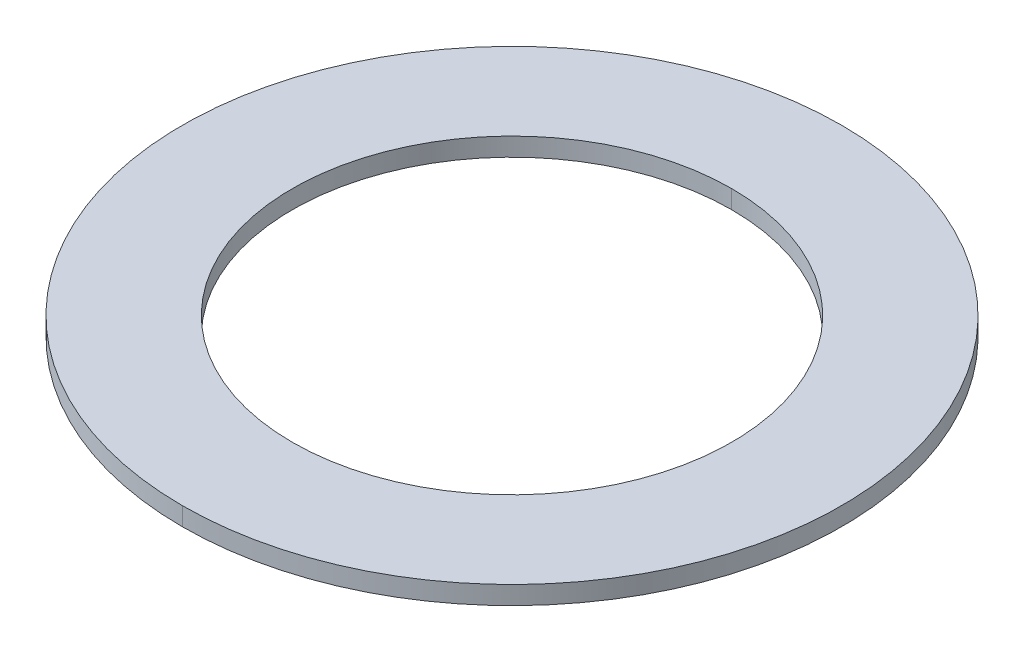
ISO-10303-21;
HEADER;
FILE_DESCRIPTION(('STEP AP214'),'2;1');
FILE_NAME('part.step','',(''),(''),'','','');
FILE_SCHEMA(('AUTOMOTIVE_DESIGN { 1 0 10303 214 1 1 1 1 }'));
ENDSEC;
DATA;
#1=APPLICATION_CONTEXT('core data for automotive mechanical design processes');
#2=APPLICATION_PROTOCOL_DEFINITION('international standard','automotive_design',2000,#1);
#3=PRODUCT_CONTEXT('',#1,'mechanical');
#4=PRODUCT('Part','Part','',(#3));
#5=PRODUCT_RELATED_PRODUCT_CATEGORY('part','',(#4));
#6=PRODUCT_DEFINITION_FORMATION('','',#4);
#7=PRODUCT_DEFINITION_CONTEXT('part definition',#1,'design');
#8=PRODUCT_DEFINITION('design','',#6,#7);
#9=PRODUCT_DEFINITION_SHAPE('','',#8);
#10=(LENGTH_UNIT() NAMED_UNIT(*) SI_UNIT(.MILLI.,.METRE.));
#11=(NAMED_UNIT(*) PLANE_ANGLE_UNIT() SI_UNIT($,.RADIAN.));
#12=(NAMED_UNIT(*) SI_UNIT($,.STERADIAN.) SOLID_ANGLE_UNIT());
#13=UNCERTAINTY_MEASURE_WITH_UNIT(LENGTH_MEASURE(1.E-05),#10,'distance_accuracy_value','');
#14=(GEOMETRIC_REPRESENTATION_CONTEXT(3) GLOBAL_UNCERTAINTY_ASSIGNED_CONTEXT((#13)) GLOBAL_UNIT_ASSIGNED_CONTEXT((#10,
#11,#12)) REPRESENTATION_CONTEXT('',''));
#15=CARTESIAN_POINT('',(0.,0.,0.));
#16=DIRECTION('',(0.,0.,1.));
#17=DIRECTION('',(1.,0.,0.));
#18=AXIS2_PLACEMENT_3D('',#15,#16,#17);
#19=CARTESIAN_POINT('',(0.,0.25,0.));
#20=DIRECTION('',(0.,-1.,0.));
#21=DIRECTION('',(0.,0.,-1.));
#22=AXIS2_PLACEMENT_3D('',#19,#20,#21);
#23=CYLINDRICAL_SURFACE('',#22,3.);
#24=CARTESIAN_POINT('',(0.,0.25,0.));
#25=DIRECTION('',(0.,1.,0.));
#26=DIRECTION('',(0.,0.,1.));
#27=AXIS2_PLACEMENT_3D('',#24,#25,#26);
#28=CIRCLE('',#27,3.);
#29=CARTESIAN_POINT('',(0.,0.25,-3.));
#30=VERTEX_POINT('',#29);
#31=CARTESIAN_POINT('',(0.,0.25,3.));
#32=VERTEX_POINT('',#31);
#33=EDGE_CURVE('E11',#30,#32,#28,.T.);
#34=ORIENTED_EDGE('',*,*,#33,.T.);
#35=DIRECTION('',(0.,-1.,0.));
#36=VECTOR('',#35,1.);
#37=CARTESIAN_POINT('',(0.,0.25,3.));
#38=LINE('',#37,#36);
#39=CARTESIAN_POINT('',(0.,0.,3.));
#40=VERTEX_POINT('',#39);
#41=EDGE_CURVE('E27',#32,#40,#38,.T.);
#42=ORIENTED_EDGE('',*,*,#41,.T.);
#43=CARTESIAN_POINT('',(0.,0.,0.));
#44=DIRECTION('',(0.,1.,0.));
#45=DIRECTION('',(0.,0.,1.));
#46=AXIS2_PLACEMENT_3D('',#43,#44,#45);
#47=CIRCLE('',#46,3.);
#48=CARTESIAN_POINT('',(0.,0.,-3.));
#49=VERTEX_POINT('',#48);
#50=EDGE_CURVE('E85',#49,#40,#47,.T.);
#51=ORIENTED_EDGE('',*,*,#50,.F.);
#52=DIRECTION('',(0.,-1.,0.));
#53=VECTOR('',#52,1.);
#54=CARTESIAN_POINT('',(0.,0.25,-3.));
#55=LINE('',#54,#53);
#56=EDGE_CURVE('E105',#30,#49,#55,.T.);
#57=ORIENTED_EDGE('',*,*,#56,.F.);
#58=EDGE_LOOP('',(#34,#42,#51,#57));
#59=FACE_BOUND('',#58,.T.);
#60=ADVANCED_FACE('F16',(#59),#23,.F.);
#61=CARTESIAN_POINT('',(0.,0.25,0.));
#62=DIRECTION('',(0.,-1.,0.));
#63=DIRECTION('',(0.,0.,-1.));
#64=AXIS2_PLACEMENT_3D('',#61,#62,#63);
#65=CYLINDRICAL_SURFACE('',#64,4.5);
#66=CARTESIAN_POINT('',(0.,0.25,0.));
#67=DIRECTION('',(0.,1.,0.));
#68=DIRECTION('',(0.,0.,1.));
#69=AXIS2_PLACEMENT_3D('',#66,#67,#68);
#70=CIRCLE('',#69,4.5);
#71=CARTESIAN_POINT('',(0.,0.25,4.5));
#72=VERTEX_POINT('',#71);
#73=CARTESIAN_POINT('',(0.,0.25,-4.5));
#74=VERTEX_POINT('',#73);
#75=EDGE_CURVE('E78',#72,#74,#70,.T.);
#76=ORIENTED_EDGE('',*,*,#75,.F.);
#77=DIRECTION('',(0.,-1.,0.));
#78=VECTOR('',#77,1.);
#79=CARTESIAN_POINT('',(0.,0.25,4.5));
#80=LINE('',#79,#78);
#81=CARTESIAN_POINT('',(0.,0.,4.5));
#82=VERTEX_POINT('',#81);
#83=EDGE_CURVE('E80',#72,#82,#80,.T.);
#84=ORIENTED_EDGE('',*,*,#83,.T.);
#85=CARTESIAN_POINT('',(0.,0.,0.));
#86=DIRECTION('',(0.,1.,0.));
#87=DIRECTION('',(0.,0.,1.));
#88=AXIS2_PLACEMENT_3D('',#85,#86,#87);
#89=CIRCLE('',#88,4.5);
#90=CARTESIAN_POINT('',(0.,0.,-4.5));
#91=VERTEX_POINT('',#90);
#92=EDGE_CURVE('E91',#82,#91,#89,.T.);
#93=ORIENTED_EDGE('',*,*,#92,.T.);
#94=DIRECTION('',(0.,-1.,0.));
#95=VECTOR('',#94,1.);
#96=CARTESIAN_POINT('',(0.,0.25,-4.5));
#97=LINE('',#96,#95);
#98=EDGE_CURVE('E60',#74,#91,#97,.T.);
#99=ORIENTED_EDGE('',*,*,#98,.F.);
#100=EDGE_LOOP('',(#76,#84,#93,#99));
#101=FACE_BOUND('',#100,.T.);
#102=ADVANCED_FACE('F18',(#101),#65,.T.);
#103=CARTESIAN_POINT('',(0.,0.25,0.));
#104=DIRECTION('',(0.,1.,0.));
#105=DIRECTION('',(1.,0.,0.));
#106=AXIS2_PLACEMENT_3D('',#103,#104,#105);
#107=PLANE('',#106);
#108=CARTESIAN_POINT('',(0.,0.25,0.));
#109=DIRECTION('',(0.,1.,0.));
#110=DIRECTION('',(0.,0.,1.));
#111=AXIS2_PLACEMENT_3D('',#108,#109,#110);
#112=CIRCLE('',#111,4.5);
#113=EDGE_CURVE('E84',#74,#72,#112,.T.);
#114=ORIENTED_EDGE('',*,*,#113,.T.);
#115=ORIENTED_EDGE('',*,*,#75,.T.);
#116=EDGE_LOOP('',(#114,#115));
#117=FACE_BOUND('',#116,.T.);
#118=ORIENTED_EDGE('',*,*,#33,.F.);
#119=CARTESIAN_POINT('',(0.,0.25,0.));
#120=DIRECTION('',(0.,1.,0.));
#121=DIRECTION('',(0.,0.,1.));
#122=AXIS2_PLACEMENT_3D('',#119,#120,#121);
#123=CIRCLE('',#122,3.);
#124=EDGE_CURVE('E111',#32,#30,#123,.T.);
#125=ORIENTED_EDGE('',*,*,#124,.F.);
#126=EDGE_LOOP('',(#118,#125));
#127=FACE_BOUND('',#126,.T.);
#128=ADVANCED_FACE('F93',(#117,#127),#107,.T.);
#129=CARTESIAN_POINT('',(0.,0.,0.));
#130=DIRECTION('',(0.,1.,0.));
#131=DIRECTION('',(1.,0.,0.));
#132=AXIS2_PLACEMENT_3D('',#129,#130,#131);
#133=PLANE('',#132);
#134=CARTESIAN_POINT('',(0.,0.,0.));
#135=DIRECTION('',(0.,1.,0.));
#136=DIRECTION('',(0.,0.,1.));
#137=AXIS2_PLACEMENT_3D('',#134,#135,#136);
#138=CIRCLE('',#137,4.5);
#139=EDGE_CURVE('E89',#91,#82,#138,.T.);
#140=ORIENTED_EDGE('',*,*,#139,.F.);
#141=ORIENTED_EDGE('',*,*,#92,.F.);
#142=EDGE_LOOP('',(#140,#141));
#143=FACE_BOUND('',#142,.T.);
#144=ORIENTED_EDGE('',*,*,#50,.T.);
#145=CARTESIAN_POINT('',(0.,0.,0.));
#146=DIRECTION('',(0.,1.,0.));
#147=DIRECTION('',(0.,0.,1.));
#148=AXIS2_PLACEMENT_3D('',#145,#146,#147);
#149=CIRCLE('',#148,3.);
#150=EDGE_CURVE('E20',#40,#49,#149,.T.);
#151=ORIENTED_EDGE('',*,*,#150,.T.);
#152=EDGE_LOOP('',(#144,#151));
#153=FACE_BOUND('',#152,.T.);
#154=ADVANCED_FACE('F121',(#143,#153),#133,.F.);
#155=CARTESIAN_POINT('',(0.,0.25,0.));
#156=DIRECTION('',(0.,-1.,0.));
#157=DIRECTION('',(0.,0.,-1.));
#158=AXIS2_PLACEMENT_3D('',#155,#156,#157);
#159=CYLINDRICAL_SURFACE('',#158,4.5);
#160=ORIENTED_EDGE('',*,*,#83,.F.);
#161=ORIENTED_EDGE('',*,*,#113,.F.);
#162=ORIENTED_EDGE('',*,*,#98,.T.);
#163=ORIENTED_EDGE('',*,*,#139,.T.);
#164=EDGE_LOOP('',(#160,#161,#162,#163));
#165=FACE_BOUND('',#164,.T.);
#166=ADVANCED_FACE('F87',(#165),#159,.T.);
#167=CARTESIAN_POINT('',(0.,0.25,0.));
#168=DIRECTION('',(0.,-1.,0.));
#169=DIRECTION('',(0.,0.,-1.));
#170=AXIS2_PLACEMENT_3D('',#167,#168,#169);
#171=CYLINDRICAL_SURFACE('',#170,3.);
#172=ORIENTED_EDGE('',*,*,#41,.F.);
#173=ORIENTED_EDGE('',*,*,#124,.T.);
#174=ORIENTED_EDGE('',*,*,#56,.T.);
#175=ORIENTED_EDGE('',*,*,#150,.F.);
#176=EDGE_LOOP('',(#172,#173,#174,#175));
#177=FACE_BOUND('',#176,.T.);
#178=ADVANCED_FACE('F124',(#177),#171,.F.);
#179=CLOSED_SHELL('',(#60,#102,#128,#154,#166,#178));
#180=MANIFOLD_SOLID_BREP('B1',#179);
#181=ADVANCED_BREP_SHAPE_REPRESENTATION('',(#18,#180),#14);
#182=SHAPE_DEFINITION_REPRESENTATION(#9,#181);
ENDSEC;
END-ISO-10303-21;
